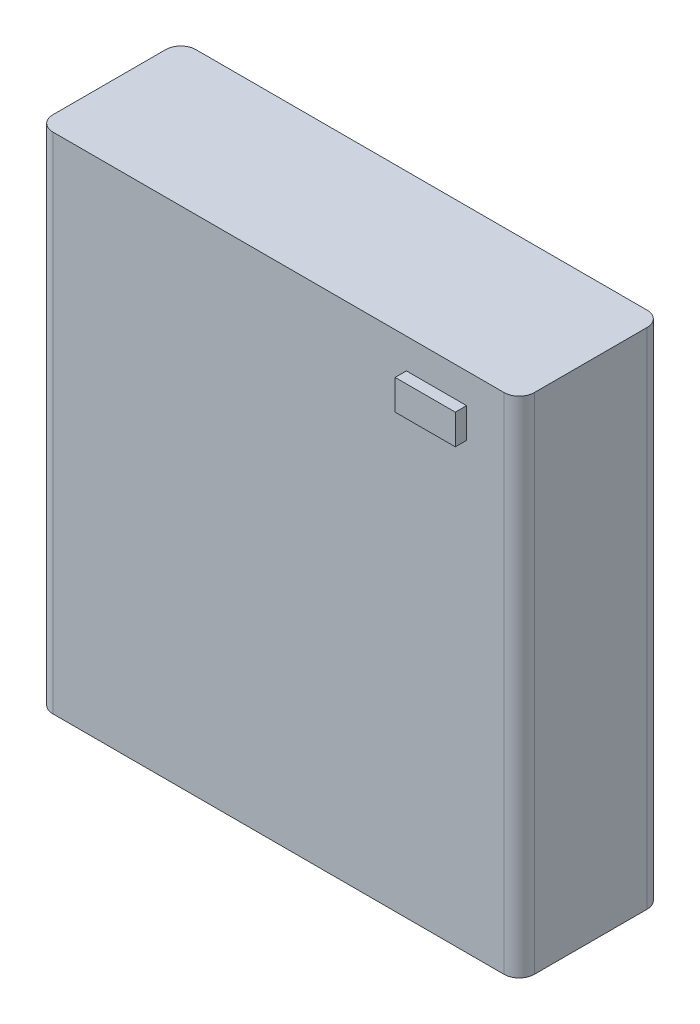
ISO-10303-21;
HEADER;
FILE_DESCRIPTION(('STEP AP214'),'2;1');
FILE_NAME('part.step','',(''),(''),'','','');
FILE_SCHEMA(('AUTOMOTIVE_DESIGN { 1 0 10303 214 1 1 1 1 }'));
ENDSEC;
DATA;
#1=APPLICATION_CONTEXT('core data for automotive mechanical design processes');
#2=APPLICATION_PROTOCOL_DEFINITION('international standard','automotive_design',2000,#1);
#3=PRODUCT_CONTEXT('',#1,'mechanical');
#4=PRODUCT('Part','Part','',(#3));
#5=PRODUCT_RELATED_PRODUCT_CATEGORY('part','',(#4));
#6=PRODUCT_DEFINITION_FORMATION('','',#4);
#7=PRODUCT_DEFINITION_CONTEXT('part definition',#1,'design');
#8=PRODUCT_DEFINITION('design','',#6,#7);
#9=PRODUCT_DEFINITION_SHAPE('','',#8);
#10=(LENGTH_UNIT() NAMED_UNIT(*) SI_UNIT(.MILLI.,.METRE.));
#11=(NAMED_UNIT(*) PLANE_ANGLE_UNIT() SI_UNIT($,.RADIAN.));
#12=(NAMED_UNIT(*) SI_UNIT($,.STERADIAN.) SOLID_ANGLE_UNIT());
#13=UNCERTAINTY_MEASURE_WITH_UNIT(LENGTH_MEASURE(1.E-05),#10,'distance_accuracy_value','');
#14=(GEOMETRIC_REPRESENTATION_CONTEXT(3) GLOBAL_UNCERTAINTY_ASSIGNED_CONTEXT((#13)) GLOBAL_UNIT_ASSIGNED_CONTEXT((#10,
#11,#12)) REPRESENTATION_CONTEXT('',''));
#15=CARTESIAN_POINT('',(0.,0.,0.));
#16=DIRECTION('',(0.,0.,1.));
#17=DIRECTION('',(1.,0.,0.));
#18=AXIS2_PLACEMENT_3D('',#15,#16,#17);
#19=CARTESIAN_POINT('',(0.,0.,19.));
#20=DIRECTION('',(0.,0.,-1.));
#21=DIRECTION('',(-1.,0.,0.));
#22=AXIS2_PLACEMENT_3D('',#19,#20,#21);
#23=PLANE('',#22);
#24=DIRECTION('',(1.,0.,0.));
#25=VECTOR('',#24,1.);
#26=CARTESIAN_POINT('',(32.,-33.5,19.));
#27=LINE('',#26,#25);
#28=CARTESIAN_POINT('',(-30.,-33.5,19.));
#29=VERTEX_POINT('',#28);
#30=CARTESIAN_POINT('',(30.,-33.5,19.));
#31=VERTEX_POINT('',#30);
#32=EDGE_CURVE('E157',#29,#31,#27,.T.);
#33=ORIENTED_EDGE('',*,*,#32,.T.);
#34=DIRECTION('',(0.,1.,0.));
#35=VECTOR('',#34,1.);
#36=CARTESIAN_POINT('',(30.,0.,19.));
#37=LINE('',#36,#35);
#38=CARTESIAN_POINT('',(30.,33.5,19.));
#39=VERTEX_POINT('',#38);
#40=EDGE_CURVE('E202',#31,#39,#37,.T.);
#41=ORIENTED_EDGE('',*,*,#40,.T.);
#42=DIRECTION('',(-1.,0.,0.));
#43=VECTOR('',#42,1.);
#44=CARTESIAN_POINT('',(32.,33.5,19.));
#45=LINE('',#44,#43);
#46=CARTESIAN_POINT('',(-30.,33.5,19.));
#47=VERTEX_POINT('',#46);
#48=EDGE_CURVE('E160',#39,#47,#45,.T.);
#49=ORIENTED_EDGE('',*,*,#48,.T.);
#50=DIRECTION('',(0.,-1.,0.));
#51=VECTOR('',#50,1.);
#52=CARTESIAN_POINT('',(-30.,0.,19.));
#53=LINE('',#52,#51);
#54=EDGE_CURVE('E199',#47,#29,#53,.T.);
#55=ORIENTED_EDGE('',*,*,#54,.T.);
#56=EDGE_LOOP('',(#33,#41,#49,#55));
#57=FACE_BOUND('',#56,.T.);
#58=DIRECTION('',(0.,-1.,0.));
#59=VECTOR('',#58,1.);
#60=CARTESIAN_POINT('',(17.,29.5,19.));
#61=LINE('',#60,#59);
#62=CARTESIAN_POINT('',(17.,29.5,19.));
#63=VERTEX_POINT('',#62);
#64=CARTESIAN_POINT('',(17.,25.5,19.));
#65=VERTEX_POINT('',#64);
#66=EDGE_CURVE('E147',#63,#65,#61,.T.);
#67=ORIENTED_EDGE('',*,*,#66,.F.);
#68=DIRECTION('',(-1.,0.,0.));
#69=VECTOR('',#68,1.);
#70=CARTESIAN_POINT('',(17.,29.5,19.));
#71=LINE('',#70,#69);
#72=CARTESIAN_POINT('',(25.,29.5,19.));
#73=VERTEX_POINT('',#72);
#74=EDGE_CURVE('E144',#73,#63,#71,.T.);
#75=ORIENTED_EDGE('',*,*,#74,.F.);
#76=DIRECTION('',(0.,1.,0.));
#77=VECTOR('',#76,1.);
#78=CARTESIAN_POINT('',(25.,29.5,19.));
#79=LINE('',#78,#77);
#80=CARTESIAN_POINT('',(25.,25.5,19.));
#81=VERTEX_POINT('',#80);
#82=EDGE_CURVE('E361',#81,#73,#79,.T.);
#83=ORIENTED_EDGE('',*,*,#82,.F.);
#84=DIRECTION('',(1.,0.,0.));
#85=VECTOR('',#84,1.);
#86=CARTESIAN_POINT('',(17.,25.5,19.));
#87=LINE('',#86,#85);
#88=EDGE_CURVE('E363',#65,#81,#87,.T.);
#89=ORIENTED_EDGE('',*,*,#88,.F.);
#90=EDGE_LOOP('',(#67,#75,#83,#89));
#91=FACE_BOUND('',#90,.T.);
#92=ADVANCED_FACE('F33',(#57,#91),#23,.F.);
#93=CARTESIAN_POINT('',(-32.,33.5,19.));
#94=DIRECTION('',(1.,0.,0.));
#95=DIRECTION('',(0.,1.,0.));
#96=AXIS2_PLACEMENT_3D('',#93,#94,#95);
#97=PLANE('',#96);
#98=DIRECTION('',(0.,0.,-1.));
#99=VECTOR('',#98,1.);
#100=CARTESIAN_POINT('',(-32.,33.5,19.));
#101=LINE('',#100,#99);
#102=CARTESIAN_POINT('',(-32.,33.5,17.));
#103=VERTEX_POINT('',#102);
#104=CARTESIAN_POINT('',(-32.,33.5,2.));
#105=VERTEX_POINT('',#104);
#106=EDGE_CURVE('E162',#103,#105,#101,.T.);
#107=ORIENTED_EDGE('',*,*,#106,.T.);
#108=DIRECTION('',(0.,-1.,0.));
#109=VECTOR('',#108,1.);
#110=CARTESIAN_POINT('',(-32.,-33.5,2.));
#111=LINE('',#110,#109);
#112=CARTESIAN_POINT('',(-32.,-33.5,2.));
#113=VERTEX_POINT('',#112);
#114=EDGE_CURVE('E11',#105,#113,#111,.T.);
#115=ORIENTED_EDGE('',*,*,#114,.T.);
#116=DIRECTION('',(0.,0.,-1.));
#117=VECTOR('',#116,1.);
#118=CARTESIAN_POINT('',(-32.,-33.5,19.));
#119=LINE('',#118,#117);
#120=CARTESIAN_POINT('',(-32.,-33.5,17.));
#121=VERTEX_POINT('',#120);
#122=EDGE_CURVE('E174',#121,#113,#119,.T.);
#123=ORIENTED_EDGE('',*,*,#122,.F.);
#124=DIRECTION('',(0.,-1.,0.));
#125=VECTOR('',#124,1.);
#126=CARTESIAN_POINT('',(-32.,33.5,17.));
#127=LINE('',#126,#125);
#128=EDGE_CURVE('E41',#121,#103,#127,.F.);
#129=ORIENTED_EDGE('',*,*,#128,.T.);
#130=EDGE_LOOP('',(#107,#115,#123,#129));
#131=FACE_BOUND('',#130,.T.);
#132=ADVANCED_FACE('F207',(#131),#97,.F.);
#133=CARTESIAN_POINT('',(32.,-33.5,19.));
#134=DIRECTION('',(0.,1.,0.));
#135=DIRECTION('',(-1.,0.,0.));
#136=AXIS2_PLACEMENT_3D('',#133,#134,#135);
#137=PLANE('',#136);
#138=DIRECTION('',(1.,0.,0.));
#139=VECTOR('',#138,1.);
#140=CARTESIAN_POINT('',(32.,-33.5,0.));
#141=LINE('',#140,#139);
#142=CARTESIAN_POINT('',(-30.,-33.5,0.));
#143=VERTEX_POINT('',#142);
#144=CARTESIAN_POINT('',(30.,-33.5,0.));
#145=VERTEX_POINT('',#144);
#146=EDGE_CURVE('E148',#143,#145,#141,.T.);
#147=ORIENTED_EDGE('',*,*,#146,.T.);
#148=CARTESIAN_POINT('',(30.,-33.5,2.));
#149=DIRECTION('',(0.,1.,0.));
#150=DIRECTION('',(-1.,0.,0.));
#151=AXIS2_PLACEMENT_3D('',#148,#149,#150);
#152=CIRCLE('',#151,2.);
#153=CARTESIAN_POINT('',(32.,-33.5,2.));
#154=VERTEX_POINT('',#153);
#155=EDGE_CURVE('E197',#145,#154,#152,.F.);
#156=ORIENTED_EDGE('',*,*,#155,.T.);
#157=DIRECTION('',(0.,0.,-1.));
#158=VECTOR('',#157,1.);
#159=CARTESIAN_POINT('',(32.,-33.5,19.));
#160=LINE('',#159,#158);
#161=CARTESIAN_POINT('',(32.,-33.5,17.));
#162=VERTEX_POINT('',#161);
#163=EDGE_CURVE('E171',#162,#154,#160,.T.);
#164=ORIENTED_EDGE('',*,*,#163,.F.);
#165=CARTESIAN_POINT('',(30.,-33.5,17.));
#166=DIRECTION('',(0.,1.,0.));
#167=DIRECTION('',(-1.,0.,0.));
#168=AXIS2_PLACEMENT_3D('',#165,#166,#167);
#169=CIRCLE('',#168,2.);
#170=EDGE_CURVE('E195',#162,#31,#169,.F.);
#171=ORIENTED_EDGE('',*,*,#170,.T.);
#172=ORIENTED_EDGE('',*,*,#32,.F.);
#173=CARTESIAN_POINT('',(-30.,-33.5,17.));
#174=DIRECTION('',(0.,1.,0.));
#175=DIRECTION('',(-1.,0.,0.));
#176=AXIS2_PLACEMENT_3D('',#173,#174,#175);
#177=CIRCLE('',#176,2.);
#178=EDGE_CURVE('E55',#29,#121,#177,.F.);
#179=ORIENTED_EDGE('',*,*,#178,.T.);
#180=ORIENTED_EDGE('',*,*,#122,.T.);
#181=CARTESIAN_POINT('',(-30.,-33.5,2.));
#182=DIRECTION('',(0.,1.,0.));
#183=DIRECTION('',(-1.,0.,0.));
#184=AXIS2_PLACEMENT_3D('',#181,#182,#183);
#185=CIRCLE('',#184,2.);
#186=EDGE_CURVE('E48',#113,#143,#185,.F.);
#187=ORIENTED_EDGE('',*,*,#186,.T.);
#188=EDGE_LOOP('',(#147,#156,#164,#171,#172,#179,#180,#187));
#189=FACE_BOUND('',#188,.T.);
#190=ADVANCED_FACE('F218',(#189),#137,.F.);
#191=CARTESIAN_POINT('',(32.,33.5,19.));
#192=DIRECTION('',(-1.,0.,0.));
#193=DIRECTION('',(0.,-1.,0.));
#194=AXIS2_PLACEMENT_3D('',#191,#192,#193);
#195=PLANE('',#194);
#196=ORIENTED_EDGE('',*,*,#163,.T.);
#197=DIRECTION('',(0.,1.,0.));
#198=VECTOR('',#197,1.);
#199=CARTESIAN_POINT('',(32.,33.5,2.));
#200=LINE('',#199,#198);
#201=CARTESIAN_POINT('',(32.,33.5,2.));
#202=VERTEX_POINT('',#201);
#203=EDGE_CURVE('E178',#154,#202,#200,.T.);
#204=ORIENTED_EDGE('',*,*,#203,.T.);
#205=DIRECTION('',(0.,0.,-1.));
#206=VECTOR('',#205,1.);
#207=CARTESIAN_POINT('',(32.,33.5,19.));
#208=LINE('',#207,#206);
#209=CARTESIAN_POINT('',(32.,33.5,17.));
#210=VERTEX_POINT('',#209);
#211=EDGE_CURVE('E168',#210,#202,#208,.T.);
#212=ORIENTED_EDGE('',*,*,#211,.F.);
#213=DIRECTION('',(0.,1.,0.));
#214=VECTOR('',#213,1.);
#215=CARTESIAN_POINT('',(32.,33.5,17.));
#216=LINE('',#215,#214);
#217=EDGE_CURVE('E176',#210,#162,#216,.F.);
#218=ORIENTED_EDGE('',*,*,#217,.T.);
#219=EDGE_LOOP('',(#196,#204,#212,#218));
#220=FACE_BOUND('',#219,.T.);
#221=ADVANCED_FACE('F226',(#220),#195,.F.);
#222=CARTESIAN_POINT('',(32.,33.5,19.));
#223=DIRECTION('',(0.,-1.,0.));
#224=DIRECTION('',(1.,0.,0.));
#225=AXIS2_PLACEMENT_3D('',#222,#223,#224);
#226=PLANE('',#225);
#227=ORIENTED_EDGE('',*,*,#211,.T.);
#228=CARTESIAN_POINT('',(30.,33.5,2.));
#229=DIRECTION('',(0.,-1.,0.));
#230=DIRECTION('',(1.,0.,0.));
#231=AXIS2_PLACEMENT_3D('',#228,#229,#230);
#232=CIRCLE('',#231,2.);
#233=CARTESIAN_POINT('',(30.,33.5,0.));
#234=VERTEX_POINT('',#233);
#235=EDGE_CURVE('E187',#202,#234,#232,.F.);
#236=ORIENTED_EDGE('',*,*,#235,.T.);
#237=DIRECTION('',(-1.,0.,0.));
#238=VECTOR('',#237,1.);
#239=CARTESIAN_POINT('',(32.,33.5,0.));
#240=LINE('',#239,#238);
#241=CARTESIAN_POINT('',(-30.,33.5,0.));
#242=VERTEX_POINT('',#241);
#243=EDGE_CURVE('E151',#234,#242,#240,.T.);
#244=ORIENTED_EDGE('',*,*,#243,.T.);
#245=CARTESIAN_POINT('',(-30.,33.5,2.));
#246=DIRECTION('',(0.,-1.,0.));
#247=DIRECTION('',(1.,0.,0.));
#248=AXIS2_PLACEMENT_3D('',#245,#246,#247);
#249=CIRCLE('',#248,2.);
#250=EDGE_CURVE('E183',#242,#105,#249,.F.);
#251=ORIENTED_EDGE('',*,*,#250,.T.);
#252=ORIENTED_EDGE('',*,*,#106,.F.);
#253=CARTESIAN_POINT('',(-30.,33.5,17.));
#254=DIRECTION('',(0.,-1.,0.));
#255=DIRECTION('',(1.,0.,0.));
#256=AXIS2_PLACEMENT_3D('',#253,#254,#255);
#257=CIRCLE('',#256,2.);
#258=EDGE_CURVE('E181',#103,#47,#257,.F.);
#259=ORIENTED_EDGE('',*,*,#258,.T.);
#260=ORIENTED_EDGE('',*,*,#48,.F.);
#261=CARTESIAN_POINT('',(30.,33.5,17.));
#262=DIRECTION('',(0.,-1.,0.));
#263=DIRECTION('',(1.,0.,0.));
#264=AXIS2_PLACEMENT_3D('',#261,#262,#263);
#265=CIRCLE('',#264,2.);
#266=EDGE_CURVE('E185',#39,#210,#265,.F.);
#267=ORIENTED_EDGE('',*,*,#266,.T.);
#268=EDGE_LOOP('',(#227,#236,#244,#251,#252,#259,#260,#267));
#269=FACE_BOUND('',#268,.T.);
#270=ADVANCED_FACE('F211',(#269),#226,.F.);
#271=CARTESIAN_POINT('',(0.,0.,0.));
#272=DIRECTION('',(0.,0.,-1.));
#273=DIRECTION('',(-1.,0.,0.));
#274=AXIS2_PLACEMENT_3D('',#271,#272,#273);
#275=PLANE('',#274);
#276=ORIENTED_EDGE('',*,*,#243,.F.);
#277=DIRECTION('',(0.,1.,0.));
#278=VECTOR('',#277,1.);
#279=CARTESIAN_POINT('',(30.,-33.5,0.));
#280=LINE('',#279,#278);
#281=EDGE_CURVE('E191',#234,#145,#280,.F.);
#282=ORIENTED_EDGE('',*,*,#281,.T.);
#283=ORIENTED_EDGE('',*,*,#146,.F.);
#284=DIRECTION('',(0.,-1.,0.));
#285=VECTOR('',#284,1.);
#286=CARTESIAN_POINT('',(-30.,33.5,0.));
#287=LINE('',#286,#285);
#288=EDGE_CURVE('E189',#143,#242,#287,.F.);
#289=ORIENTED_EDGE('',*,*,#288,.T.);
#290=EDGE_LOOP('',(#276,#282,#283,#289));
#291=FACE_BOUND('',#290,.T.);
#292=ADVANCED_FACE('F234',(#291),#275,.T.);
#293=CARTESIAN_POINT('',(17.,29.5,20.5));
#294=DIRECTION('',(1.,0.,0.));
#295=DIRECTION('',(0.,0.,-1.));
#296=AXIS2_PLACEMENT_3D('',#293,#294,#295);
#297=PLANE('',#296);
#298=ORIENTED_EDGE('',*,*,#66,.T.);
#299=DIRECTION('',(0.,0.,-1.));
#300=VECTOR('',#299,1.);
#301=CARTESIAN_POINT('',(17.,25.5,20.5));
#302=LINE('',#301,#300);
#303=CARTESIAN_POINT('',(17.,25.5,20.5));
#304=VERTEX_POINT('',#303);
#305=EDGE_CURVE('E128',#304,#65,#302,.T.);
#306=ORIENTED_EDGE('',*,*,#305,.F.);
#307=DIRECTION('',(0.,-1.,0.));
#308=VECTOR('',#307,1.);
#309=CARTESIAN_POINT('',(17.,29.5,20.5));
#310=LINE('',#309,#308);
#311=CARTESIAN_POINT('',(17.,29.5,20.5));
#312=VERTEX_POINT('',#311);
#313=EDGE_CURVE('E135',#312,#304,#310,.T.);
#314=ORIENTED_EDGE('',*,*,#313,.F.);
#315=DIRECTION('',(0.,0.,-1.));
#316=VECTOR('',#315,1.);
#317=CARTESIAN_POINT('',(17.,29.5,20.5));
#318=LINE('',#317,#316);
#319=EDGE_CURVE('E366',#312,#63,#318,.T.);
#320=ORIENTED_EDGE('',*,*,#319,.T.);
#321=EDGE_LOOP('',(#298,#306,#314,#320));
#322=FACE_BOUND('',#321,.T.);
#323=ADVANCED_FACE('F146',(#322),#297,.F.);
#324=CARTESIAN_POINT('',(17.,25.5,20.5));
#325=DIRECTION('',(0.,1.,0.));
#326=DIRECTION('',(0.,0.,1.));
#327=AXIS2_PLACEMENT_3D('',#324,#325,#326);
#328=PLANE('',#327);
#329=ORIENTED_EDGE('',*,*,#88,.T.);
#330=DIRECTION('',(0.,0.,-1.));
#331=VECTOR('',#330,1.);
#332=CARTESIAN_POINT('',(25.,25.5,20.5));
#333=LINE('',#332,#331);
#334=CARTESIAN_POINT('',(25.,25.5,20.5));
#335=VERTEX_POINT('',#334);
#336=EDGE_CURVE('E131',#335,#81,#333,.T.);
#337=ORIENTED_EDGE('',*,*,#336,.F.);
#338=DIRECTION('',(1.,0.,0.));
#339=VECTOR('',#338,1.);
#340=CARTESIAN_POINT('',(17.,25.5,20.5));
#341=LINE('',#340,#339);
#342=EDGE_CURVE('E123',#304,#335,#341,.T.);
#343=ORIENTED_EDGE('',*,*,#342,.F.);
#344=ORIENTED_EDGE('',*,*,#305,.T.);
#345=EDGE_LOOP('',(#329,#337,#343,#344));
#346=FACE_BOUND('',#345,.T.);
#347=ADVANCED_FACE('F126',(#346),#328,.F.);
#348=CARTESIAN_POINT('',(25.,29.5,20.5));
#349=DIRECTION('',(-1.,0.,0.));
#350=DIRECTION('',(0.,0.,1.));
#351=AXIS2_PLACEMENT_3D('',#348,#349,#350);
#352=PLANE('',#351);
#353=ORIENTED_EDGE('',*,*,#82,.T.);
#354=DIRECTION('',(0.,0.,-1.));
#355=VECTOR('',#354,1.);
#356=CARTESIAN_POINT('',(25.,29.5,20.5));
#357=LINE('',#356,#355);
#358=CARTESIAN_POINT('',(25.,29.5,20.5));
#359=VERTEX_POINT('',#358);
#360=EDGE_CURVE('E153',#359,#73,#357,.T.);
#361=ORIENTED_EDGE('',*,*,#360,.F.);
#362=DIRECTION('',(0.,1.,0.));
#363=VECTOR('',#362,1.);
#364=CARTESIAN_POINT('',(25.,29.5,20.5));
#365=LINE('',#364,#363);
#366=EDGE_CURVE('E134',#335,#359,#365,.T.);
#367=ORIENTED_EDGE('',*,*,#366,.F.);
#368=ORIENTED_EDGE('',*,*,#336,.T.);
#369=EDGE_LOOP('',(#353,#361,#367,#368));
#370=FACE_BOUND('',#369,.T.);
#371=ADVANCED_FACE('F269',(#370),#352,.F.);
#372=CARTESIAN_POINT('',(17.,29.5,20.5));
#373=DIRECTION('',(0.,-1.,0.));
#374=DIRECTION('',(0.,0.,-1.));
#375=AXIS2_PLACEMENT_3D('',#372,#373,#374);
#376=PLANE('',#375);
#377=ORIENTED_EDGE('',*,*,#74,.T.);
#378=ORIENTED_EDGE('',*,*,#319,.F.);
#379=DIRECTION('',(-1.,0.,0.));
#380=VECTOR('',#379,1.);
#381=CARTESIAN_POINT('',(17.,29.5,20.5));
#382=LINE('',#381,#380);
#383=EDGE_CURVE('E140',#359,#312,#382,.T.);
#384=ORIENTED_EDGE('',*,*,#383,.F.);
#385=ORIENTED_EDGE('',*,*,#360,.T.);
#386=EDGE_LOOP('',(#377,#378,#384,#385));
#387=FACE_BOUND('',#386,.T.);
#388=ADVANCED_FACE('F264',(#387),#376,.F.);
#389=CARTESIAN_POINT('',(0.,0.,20.5));
#390=DIRECTION('',(0.,0.,1.));
#391=DIRECTION('',(1.,0.,0.));
#392=AXIS2_PLACEMENT_3D('',#389,#390,#391);
#393=PLANE('',#392);
#394=ORIENTED_EDGE('',*,*,#313,.T.);
#395=ORIENTED_EDGE('',*,*,#342,.T.);
#396=ORIENTED_EDGE('',*,*,#366,.T.);
#397=ORIENTED_EDGE('',*,*,#383,.T.);
#398=EDGE_LOOP('',(#394,#395,#396,#397));
#399=FACE_BOUND('',#398,.T.);
#400=ADVANCED_FACE('F138',(#399),#393,.T.);
#401=CARTESIAN_POINT('',(30.,33.5,2.));
#402=DIRECTION('',(0.,-1.,0.));
#403=DIRECTION('',(1.,0.,0.));
#404=AXIS2_PLACEMENT_3D('',#401,#402,#403);
#405=CYLINDRICAL_SURFACE('',#404,2.);
#406=ORIENTED_EDGE('',*,*,#155,.F.);
#407=ORIENTED_EDGE('',*,*,#281,.F.);
#408=ORIENTED_EDGE('',*,*,#235,.F.);
#409=ORIENTED_EDGE('',*,*,#203,.F.);
#410=EDGE_LOOP('',(#406,#407,#408,#409));
#411=FACE_BOUND('',#410,.T.);
#412=ADVANCED_FACE('F230',(#411),#405,.T.);
#413=CARTESIAN_POINT('',(30.,0.,17.));
#414=DIRECTION('',(0.,1.,0.));
#415=DIRECTION('',(-1.,0.,0.));
#416=AXIS2_PLACEMENT_3D('',#413,#414,#415);
#417=CYLINDRICAL_SURFACE('',#416,2.);
#418=ORIENTED_EDGE('',*,*,#170,.F.);
#419=ORIENTED_EDGE('',*,*,#217,.F.);
#420=ORIENTED_EDGE('',*,*,#266,.F.);
#421=ORIENTED_EDGE('',*,*,#40,.F.);
#422=EDGE_LOOP('',(#418,#419,#420,#421));
#423=FACE_BOUND('',#422,.T.);
#424=ADVANCED_FACE('F223',(#423),#417,.T.);
#425=CARTESIAN_POINT('',(-30.,33.5,2.));
#426=DIRECTION('',(0.,1.,0.));
#427=DIRECTION('',(-1.,0.,0.));
#428=AXIS2_PLACEMENT_3D('',#425,#426,#427);
#429=CYLINDRICAL_SURFACE('',#428,2.);
#430=ORIENTED_EDGE('',*,*,#250,.F.);
#431=ORIENTED_EDGE('',*,*,#288,.F.);
#432=ORIENTED_EDGE('',*,*,#186,.F.);
#433=ORIENTED_EDGE('',*,*,#114,.F.);
#434=EDGE_LOOP('',(#430,#431,#432,#433));
#435=FACE_BOUND('',#434,.T.);
#436=ADVANCED_FACE('F236',(#435),#429,.T.);
#437=CARTESIAN_POINT('',(-30.,0.,17.));
#438=DIRECTION('',(0.,-1.,0.));
#439=DIRECTION('',(1.,0.,0.));
#440=AXIS2_PLACEMENT_3D('',#437,#438,#439);
#441=CYLINDRICAL_SURFACE('',#440,2.);
#442=ORIENTED_EDGE('',*,*,#258,.F.);
#443=ORIENTED_EDGE('',*,*,#128,.F.);
#444=ORIENTED_EDGE('',*,*,#178,.F.);
#445=ORIENTED_EDGE('',*,*,#54,.F.);
#446=EDGE_LOOP('',(#442,#443,#444,#445));
#447=FACE_BOUND('',#446,.T.);
#448=ADVANCED_FACE('F35',(#447),#441,.T.);
#449=CLOSED_SHELL('',(#92,#132,#190,#221,#270,#292,#323,#347,#371,#388,#400,#412,#424,#436,#448));
#450=MANIFOLD_SOLID_BREP('B2',#449);
#451=ADVANCED_BREP_SHAPE_REPRESENTATION('',(#18,#450),#14);
#452=SHAPE_DEFINITION_REPRESENTATION(#9,#451);
ENDSEC;
END-ISO-10303-21;
